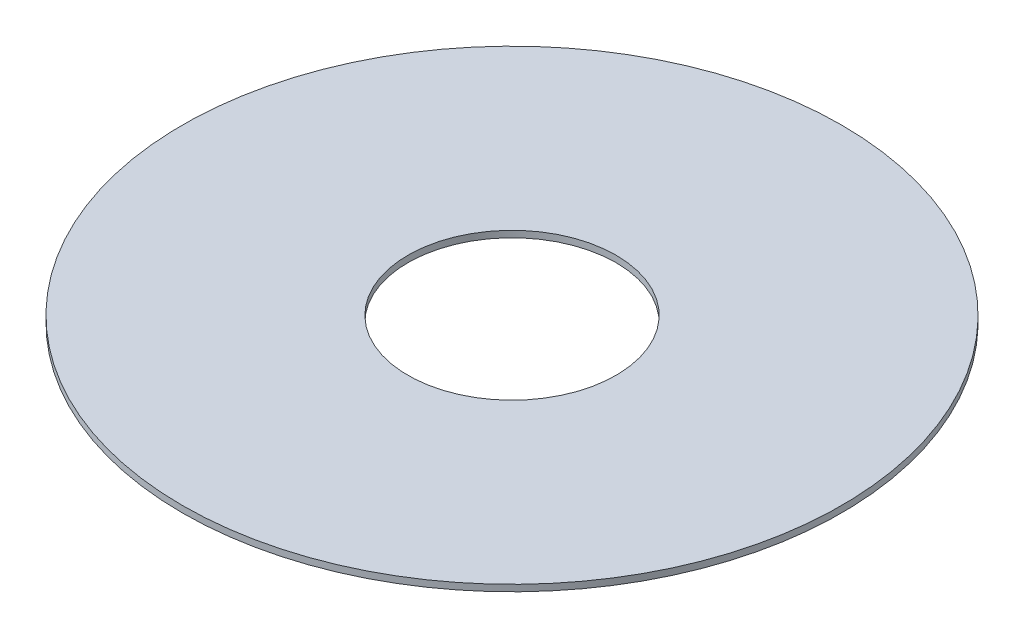
ISO-10303-21;
HEADER;
FILE_DESCRIPTION(('STEP AP214'),'2;1');
FILE_NAME('part.step','',(''),(''),'','','');
FILE_SCHEMA(('AUTOMOTIVE_DESIGN { 1 0 10303 214 1 1 1 1 }'));
ENDSEC;
DATA;
#1=APPLICATION_CONTEXT('core data for automotive mechanical design processes');
#2=APPLICATION_PROTOCOL_DEFINITION('international standard','automotive_design',2000,#1);
#3=PRODUCT_CONTEXT('',#1,'mechanical');
#4=PRODUCT('Part','Part','',(#3));
#5=PRODUCT_RELATED_PRODUCT_CATEGORY('part','',(#4));
#6=PRODUCT_DEFINITION_FORMATION('','',#4);
#7=PRODUCT_DEFINITION_CONTEXT('part definition',#1,'design');
#8=PRODUCT_DEFINITION('design','',#6,#7);
#9=PRODUCT_DEFINITION_SHAPE('','',#8);
#10=(LENGTH_UNIT() NAMED_UNIT(*) SI_UNIT(.MILLI.,.METRE.));
#11=(NAMED_UNIT(*) PLANE_ANGLE_UNIT() SI_UNIT($,.RADIAN.));
#12=(NAMED_UNIT(*) SI_UNIT($,.STERADIAN.) SOLID_ANGLE_UNIT());
#13=UNCERTAINTY_MEASURE_WITH_UNIT(LENGTH_MEASURE(1.E-05),#10,'distance_accuracy_value','');
#14=(GEOMETRIC_REPRESENTATION_CONTEXT(3) GLOBAL_UNCERTAINTY_ASSIGNED_CONTEXT((#13)) GLOBAL_UNIT_ASSIGNED_CONTEXT((#10,
#11,#12)) REPRESENTATION_CONTEXT('',''));
#15=CARTESIAN_POINT('',(0.,0.,0.));
#16=DIRECTION('',(0.,0.,1.));
#17=DIRECTION('',(1.,0.,0.));
#18=AXIS2_PLACEMENT_3D('',#15,#16,#17);
#19=CARTESIAN_POINT('',(0.,4.7625,0.));
#20=DIRECTION('',(0.,1.,0.));
#21=DIRECTION('',(0.,0.,1.));
#22=AXIS2_PLACEMENT_3D('',#19,#20,#21);
#23=PLANE('',#22);
#24=CARTESIAN_POINT('',(0.,4.7625,0.));
#25=DIRECTION('',(0.,1.,0.));
#26=DIRECTION('',(0.,0.,1.));
#27=AXIS2_PLACEMENT_3D('',#24,#25,#26);
#28=CIRCLE('',#27,241.3);
#29=CARTESIAN_POINT('',(0.,4.7625,-241.3));
#30=VERTEX_POINT('',#29);
#31=EDGE_CURVE('E10',#30,#30,#28,.T.);
#32=ORIENTED_EDGE('',*,*,#31,.T.);
#33=EDGE_LOOP('',(#32));
#34=FACE_BOUND('',#33,.T.);
#35=CARTESIAN_POINT('',(0.,4.7625,0.));
#36=DIRECTION('',(0.,1.,0.));
#37=DIRECTION('',(0.,0.,1.));
#38=AXIS2_PLACEMENT_3D('',#35,#36,#37);
#39=CIRCLE('',#38,76.2);
#40=CARTESIAN_POINT('',(0.,4.7625,-76.2));
#41=VERTEX_POINT('',#40);
#42=EDGE_CURVE('E39',#41,#41,#39,.T.);
#43=ORIENTED_EDGE('',*,*,#42,.F.);
#44=EDGE_LOOP('',(#43));
#45=FACE_BOUND('',#44,.T.);
#46=ADVANCED_FACE('F28',(#34,#45),#23,.T.);
#47=CARTESIAN_POINT('',(0.,0.,0.));
#48=DIRECTION('',(0.,1.,0.));
#49=DIRECTION('',(0.,0.,1.));
#50=AXIS2_PLACEMENT_3D('',#47,#48,#49);
#51=PLANE('',#50);
#52=CARTESIAN_POINT('',(0.,0.,0.));
#53=DIRECTION('',(0.,1.,0.));
#54=DIRECTION('',(0.,0.,1.));
#55=AXIS2_PLACEMENT_3D('',#52,#53,#54);
#56=CIRCLE('',#55,241.3);
#57=CARTESIAN_POINT('',(0.,0.,-241.3));
#58=VERTEX_POINT('',#57);
#59=EDGE_CURVE('E32',#58,#58,#56,.T.);
#60=ORIENTED_EDGE('',*,*,#59,.F.);
#61=EDGE_LOOP('',(#60));
#62=FACE_BOUND('',#61,.T.);
#63=CARTESIAN_POINT('',(0.,0.,0.));
#64=DIRECTION('',(0.,1.,0.));
#65=DIRECTION('',(0.,0.,1.));
#66=AXIS2_PLACEMENT_3D('',#63,#64,#65);
#67=CIRCLE('',#66,76.2);
#68=CARTESIAN_POINT('',(0.,0.,-76.2));
#69=VERTEX_POINT('',#68);
#70=EDGE_CURVE('E41',#69,#69,#67,.T.);
#71=ORIENTED_EDGE('',*,*,#70,.T.);
#72=EDGE_LOOP('',(#71));
#73=FACE_BOUND('',#72,.T.);
#74=ADVANCED_FACE('F51',(#62,#73),#51,.F.);
#75=CARTESIAN_POINT('',(0.,4.7625,0.));
#76=DIRECTION('',(0.,-1.,0.));
#77=DIRECTION('',(0.,0.,-1.));
#78=AXIS2_PLACEMENT_3D('',#75,#76,#77);
#79=CYLINDRICAL_SURFACE('',#78,241.3);
#80=CARTESIAN_POINT('',(0.,4.7625,-241.3));
#81=CARTESIAN_POINT('',(0.,4.712890625,-241.3));
#82=CARTESIAN_POINT('',(0.,4.66328125,-241.3));
#83=CARTESIAN_POINT('',(0.,4.5640625,-241.3));
#84=CARTESIAN_POINT('',(0.,4.514453125,-241.3));
#85=CARTESIAN_POINT('',(0.,4.415234375,-241.3));
#86=CARTESIAN_POINT('',(0.,4.365625,-241.3));
#87=CARTESIAN_POINT('',(0.,4.26640625,-241.3));
#88=CARTESIAN_POINT('',(0.,4.216796875,-241.3));
#89=CARTESIAN_POINT('',(0.,4.117578125,-241.3));
#90=CARTESIAN_POINT('',(0.,4.06796875,-241.3));
#91=CARTESIAN_POINT('',(0.,3.96875,-241.3));
#92=CARTESIAN_POINT('',(0.,3.919140625,-241.3));
#93=CARTESIAN_POINT('',(0.,3.819921875,-241.3));
#94=CARTESIAN_POINT('',(0.,3.7703125,-241.3));
#95=CARTESIAN_POINT('',(0.,3.67109375,-241.3));
#96=CARTESIAN_POINT('',(0.,3.621484375,-241.3));
#97=CARTESIAN_POINT('',(0.,3.522265625,-241.3));
#98=CARTESIAN_POINT('',(0.,3.47265625,-241.3));
#99=CARTESIAN_POINT('',(0.,3.3734375,-241.3));
#100=CARTESIAN_POINT('',(0.,3.323828125,-241.3));
#101=CARTESIAN_POINT('',(0.,3.224609375,-241.3));
#102=CARTESIAN_POINT('',(0.,3.175,-241.3));
#103=CARTESIAN_POINT('',(0.,3.07578125,-241.3));
#104=CARTESIAN_POINT('',(0.,3.026171875,-241.3));
#105=CARTESIAN_POINT('',(0.,2.926953125,-241.3));
#106=CARTESIAN_POINT('',(0.,2.87734375,-241.3));
#107=CARTESIAN_POINT('',(0.,2.778125,-241.3));
#108=CARTESIAN_POINT('',(0.,2.728515625,-241.3));
#109=CARTESIAN_POINT('',(0.,2.629296875,-241.3));
#110=CARTESIAN_POINT('',(0.,2.5796875,-241.3));
#111=CARTESIAN_POINT('',(0.,2.48046875,-241.3));
#112=CARTESIAN_POINT('',(0.,2.430859375,-241.3));
#113=CARTESIAN_POINT('',(0.,2.331640625,-241.3));
#114=CARTESIAN_POINT('',(0.,2.28203125,-241.3));
#115=CARTESIAN_POINT('',(0.,2.1828125,-241.3));
#116=CARTESIAN_POINT('',(0.,2.133203125,-241.3));
#117=CARTESIAN_POINT('',(0.,2.033984375,-241.3));
#118=CARTESIAN_POINT('',(0.,1.984375,-241.3));
#119=CARTESIAN_POINT('',(0.,1.88515625,-241.3));
#120=CARTESIAN_POINT('',(0.,1.835546875,-241.3));
#121=CARTESIAN_POINT('',(0.,1.736328125,-241.3));
#122=CARTESIAN_POINT('',(0.,1.68671875,-241.3));
#123=CARTESIAN_POINT('',(0.,1.5875,-241.3));
#124=CARTESIAN_POINT('',(0.,1.537890625,-241.3));
#125=CARTESIAN_POINT('',(0.,1.438671875,-241.3));
#126=CARTESIAN_POINT('',(0.,1.3890625,-241.3));
#127=CARTESIAN_POINT('',(0.,1.28984375,-241.3));
#128=CARTESIAN_POINT('',(0.,1.240234375,-241.3));
#129=CARTESIAN_POINT('',(0.,1.141015625,-241.3));
#130=CARTESIAN_POINT('',(0.,1.09140625,-241.3));
#131=CARTESIAN_POINT('',(0.,0.9921875,-241.3));
#132=CARTESIAN_POINT('',(0.,0.942578125,-241.3));
#133=CARTESIAN_POINT('',(0.,0.843359375,-241.3));
#134=CARTESIAN_POINT('',(0.,0.79375,-241.3));
#135=CARTESIAN_POINT('',(0.,0.69453125,-241.3));
#136=CARTESIAN_POINT('',(0.,0.644921875,-241.3));
#137=CARTESIAN_POINT('',(0.,0.545703125,-241.3));
#138=CARTESIAN_POINT('',(0.,0.49609375,-241.3));
#139=CARTESIAN_POINT('',(0.,0.396875,-241.3));
#140=CARTESIAN_POINT('',(0.,0.347265625,-241.3));
#141=CARTESIAN_POINT('',(0.,0.248046875,-241.3));
#142=CARTESIAN_POINT('',(0.,0.1984375,-241.3));
#143=CARTESIAN_POINT('',(0.,0.09921875,-241.3));
#144=CARTESIAN_POINT('',(0.,0.049609375,-241.3));
#145=CARTESIAN_POINT('',(0.,0.,-241.3));
#146=B_SPLINE_CURVE_WITH_KNOTS('',3,(#80,#81,#82,#83,#84,#85,#86,#87,#88,#89,#90,#91,#92,#93,
#94,#95,#96,#97,#98,#99,#100,#101,#102,#103,#104,#105,#106,#107,#108,#109,#110,#111,#112,#113,
#114,#115,#116,#117,#118,#119,#120,#121,#122,#123,#124,#125,#126,#127,#128,#129,#130,#131,#132,
#133,#134,#135,#136,#137,#138,#139,#140,#141,#142,#143,#144,#145),.UNSPECIFIED.,.F.,.F.,(4,2,2,
2,2,2,2,2,2,2,2,2,2,2,2,2,2,2,2,2,2,2,2,2,2,2,2,2,2,2,2,2,4),(0.,0.148828124999999,
0.297656249999999,0.446484374999999,0.595312499999999,0.744140625,0.89296875,1.041796875,
1.190625,1.339453125,1.48828125,1.637109375,1.7859375,1.934765625,2.08359375,2.232421875,
2.38125,2.530078125,2.67890625,2.827734375,2.9765625,3.125390625,3.27421875,3.423046875,
3.571875,3.720703125,3.86953125,4.018359375,4.1671875,4.316015625,4.46484375,4.613671875,
4.7625),.UNSPECIFIED.);
#147=EDGE_CURVE('BSEAM30',#30,#58,#146,.T.);
#148=ORIENTED_EDGE('',*,*,#31,.F.);
#149=ORIENTED_EDGE('',*,*,#59,.T.);
#150=ORIENTED_EDGE('',*,*,#147,.T.);
#151=ORIENTED_EDGE('',*,*,#147,.F.);
#152=EDGE_LOOP('',(#148,#150,#149,#151));
#153=FACE_BOUND('',#152,.T.);
#154=ADVANCED_FACE('F30',(#153),#79,.T.);
#155=CARTESIAN_POINT('',(0.,4.7625,0.));
#156=DIRECTION('',(0.,-1.,0.));
#157=DIRECTION('',(0.,0.,-1.));
#158=AXIS2_PLACEMENT_3D('',#155,#156,#157);
#159=CYLINDRICAL_SURFACE('',#158,76.2);
#160=CARTESIAN_POINT('',(0.,4.7625,-76.2));
#161=CARTESIAN_POINT('',(0.,4.712890625,-76.2));
#162=CARTESIAN_POINT('',(0.,4.66328125,-76.2));
#163=CARTESIAN_POINT('',(0.,4.5640625,-76.2));
#164=CARTESIAN_POINT('',(0.,4.514453125,-76.2));
#165=CARTESIAN_POINT('',(0.,4.415234375,-76.2));
#166=CARTESIAN_POINT('',(0.,4.365625,-76.2));
#167=CARTESIAN_POINT('',(0.,4.26640625,-76.2));
#168=CARTESIAN_POINT('',(0.,4.216796875,-76.2));
#169=CARTESIAN_POINT('',(0.,4.117578125,-76.2));
#170=CARTESIAN_POINT('',(0.,4.06796875,-76.2));
#171=CARTESIAN_POINT('',(0.,3.96875,-76.2));
#172=CARTESIAN_POINT('',(0.,3.919140625,-76.2));
#173=CARTESIAN_POINT('',(0.,3.819921875,-76.2));
#174=CARTESIAN_POINT('',(0.,3.7703125,-76.2));
#175=CARTESIAN_POINT('',(0.,3.67109375,-76.2));
#176=CARTESIAN_POINT('',(0.,3.621484375,-76.2));
#177=CARTESIAN_POINT('',(0.,3.522265625,-76.2));
#178=CARTESIAN_POINT('',(0.,3.47265625,-76.2));
#179=CARTESIAN_POINT('',(0.,3.3734375,-76.2));
#180=CARTESIAN_POINT('',(0.,3.323828125,-76.2));
#181=CARTESIAN_POINT('',(0.,3.224609375,-76.2));
#182=CARTESIAN_POINT('',(0.,3.175,-76.2));
#183=CARTESIAN_POINT('',(0.,3.07578125,-76.2));
#184=CARTESIAN_POINT('',(0.,3.026171875,-76.2));
#185=CARTESIAN_POINT('',(0.,2.926953125,-76.2));
#186=CARTESIAN_POINT('',(0.,2.87734375,-76.2));
#187=CARTESIAN_POINT('',(0.,2.778125,-76.2));
#188=CARTESIAN_POINT('',(0.,2.728515625,-76.2));
#189=CARTESIAN_POINT('',(0.,2.629296875,-76.2));
#190=CARTESIAN_POINT('',(0.,2.5796875,-76.2));
#191=CARTESIAN_POINT('',(0.,2.48046875,-76.2));
#192=CARTESIAN_POINT('',(0.,2.430859375,-76.2));
#193=CARTESIAN_POINT('',(0.,2.331640625,-76.2));
#194=CARTESIAN_POINT('',(0.,2.28203125,-76.2));
#195=CARTESIAN_POINT('',(0.,2.1828125,-76.2));
#196=CARTESIAN_POINT('',(0.,2.133203125,-76.2));
#197=CARTESIAN_POINT('',(0.,2.033984375,-76.2));
#198=CARTESIAN_POINT('',(0.,1.984375,-76.2));
#199=CARTESIAN_POINT('',(0.,1.88515625,-76.2));
#200=CARTESIAN_POINT('',(0.,1.835546875,-76.2));
#201=CARTESIAN_POINT('',(0.,1.736328125,-76.2));
#202=CARTESIAN_POINT('',(0.,1.68671875,-76.2));
#203=CARTESIAN_POINT('',(0.,1.5875,-76.2));
#204=CARTESIAN_POINT('',(0.,1.537890625,-76.2));
#205=CARTESIAN_POINT('',(0.,1.438671875,-76.2));
#206=CARTESIAN_POINT('',(0.,1.3890625,-76.2));
#207=CARTESIAN_POINT('',(0.,1.28984375,-76.2));
#208=CARTESIAN_POINT('',(0.,1.240234375,-76.2));
#209=CARTESIAN_POINT('',(0.,1.141015625,-76.2));
#210=CARTESIAN_POINT('',(0.,1.09140625,-76.2));
#211=CARTESIAN_POINT('',(0.,0.9921875,-76.2));
#212=CARTESIAN_POINT('',(0.,0.942578125,-76.2));
#213=CARTESIAN_POINT('',(0.,0.843359375,-76.2));
#214=CARTESIAN_POINT('',(0.,0.79375,-76.2));
#215=CARTESIAN_POINT('',(0.,0.69453125,-76.2));
#216=CARTESIAN_POINT('',(0.,0.644921875,-76.2));
#217=CARTESIAN_POINT('',(0.,0.545703125,-76.2));
#218=CARTESIAN_POINT('',(0.,0.49609375,-76.2));
#219=CARTESIAN_POINT('',(0.,0.396875,-76.2));
#220=CARTESIAN_POINT('',(0.,0.347265625,-76.2));
#221=CARTESIAN_POINT('',(0.,0.248046875,-76.2));
#222=CARTESIAN_POINT('',(0.,0.1984375,-76.2));
#223=CARTESIAN_POINT('',(0.,0.09921875,-76.2));
#224=CARTESIAN_POINT('',(0.,0.049609375,-76.2));
#225=CARTESIAN_POINT('',(0.,0.,-76.2));
#226=B_SPLINE_CURVE_WITH_KNOTS('',3,(#160,#161,#162,#163,#164,#165,#166,#167,#168,#169,#170,
#171,#172,#173,#174,#175,#176,#177,#178,#179,#180,#181,#182,#183,#184,#185,#186,#187,#188,#189,
#190,#191,#192,#193,#194,#195,#196,#197,#198,#199,#200,#201,#202,#203,#204,#205,#206,#207,#208,
#209,#210,#211,#212,#213,#214,#215,#216,#217,#218,#219,#220,#221,#222,#223,#224,#225),
.UNSPECIFIED.,.F.,.F.,(4,2,2,2,2,2,2,2,2,2,2,2,2,2,2,2,2,2,2,2,2,2,2,2,2,2,2,2,2,2,2,2,4),(0.,
0.148828124999999,0.297656249999999,0.446484374999999,0.595312499999999,0.744140625,0.89296875,
1.041796875,1.190625,1.339453125,1.48828125,1.637109375,1.7859375,1.934765625,2.08359375,
2.232421875,2.38125,2.530078125,2.67890625,2.827734375,2.9765625,3.125390625,3.27421875,
3.423046875,3.571875,3.720703125,3.86953125,4.018359375,4.1671875,4.316015625,4.46484375,
4.613671875,4.7625),.UNSPECIFIED.);
#227=EDGE_CURVE('BSEAM47',#41,#69,#226,.T.);
#228=ORIENTED_EDGE('',*,*,#42,.T.);
#229=ORIENTED_EDGE('',*,*,#70,.F.);
#230=ORIENTED_EDGE('',*,*,#227,.T.);
#231=ORIENTED_EDGE('',*,*,#227,.F.);
#232=EDGE_LOOP('',(#228,#230,#229,#231));
#233=FACE_BOUND('',#232,.T.);
#234=ADVANCED_FACE('F47',(#233),#159,.F.);
#235=CLOSED_SHELL('',(#46,#74,#154,#234));
#236=MANIFOLD_SOLID_BREP('B2',#235);
#237=ADVANCED_BREP_SHAPE_REPRESENTATION('',(#18,#236),#14);
#238=SHAPE_DEFINITION_REPRESENTATION(#9,#237);
ENDSEC;
END-ISO-10303-21;
